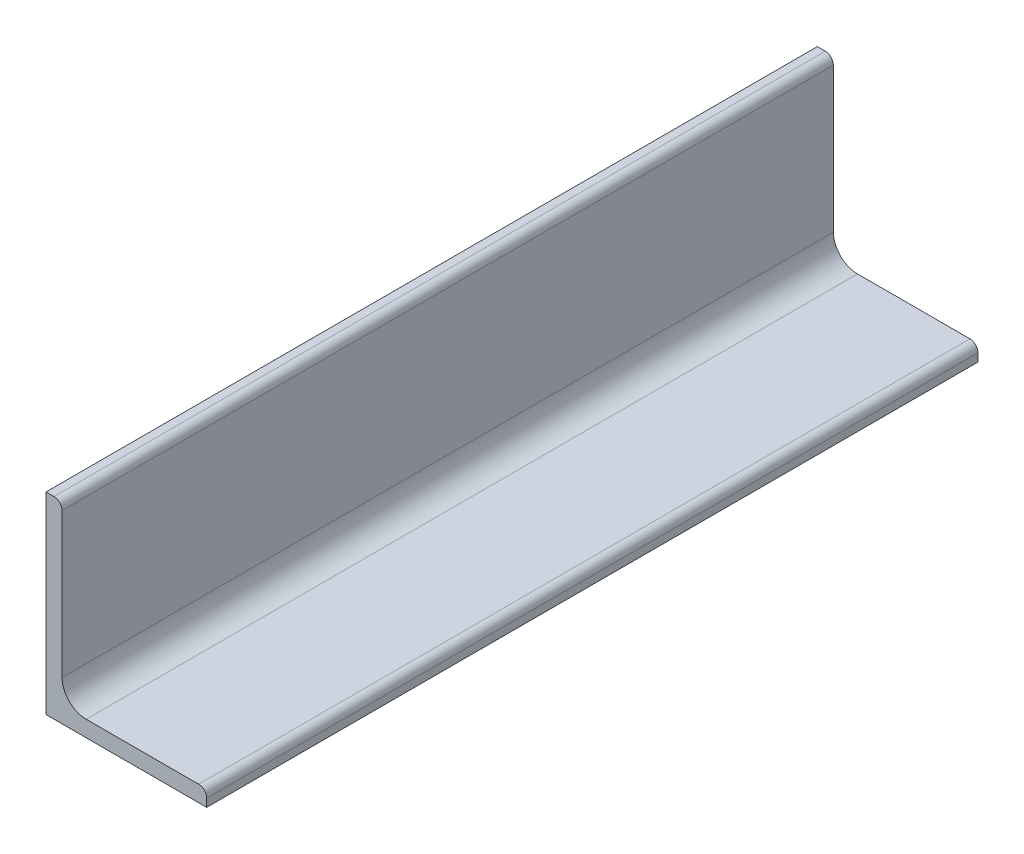
ISO-10303-21;
HEADER;
FILE_DESCRIPTION(('STEP AP214'),'2;1');
FILE_NAME('part.step','',(''),(''),'','','');
FILE_SCHEMA(('AUTOMOTIVE_DESIGN { 1 0 10303 214 1 1 1 1 }'));
ENDSEC;
DATA;
#1=APPLICATION_CONTEXT('core data for automotive mechanical design processes');
#2=APPLICATION_PROTOCOL_DEFINITION('international standard','automotive_design',2000,#1);
#3=PRODUCT_CONTEXT('',#1,'mechanical');
#4=PRODUCT('Part','Part','',(#3));
#5=PRODUCT_RELATED_PRODUCT_CATEGORY('part','',(#4));
#6=PRODUCT_DEFINITION_FORMATION('','',#4);
#7=PRODUCT_DEFINITION_CONTEXT('part definition',#1,'design');
#8=PRODUCT_DEFINITION('design','',#6,#7);
#9=PRODUCT_DEFINITION_SHAPE('','',#8);
#10=(LENGTH_UNIT() NAMED_UNIT(*) SI_UNIT(.MILLI.,.METRE.));
#11=(NAMED_UNIT(*) PLANE_ANGLE_UNIT() SI_UNIT($,.RADIAN.));
#12=(NAMED_UNIT(*) SI_UNIT($,.STERADIAN.) SOLID_ANGLE_UNIT());
#13=UNCERTAINTY_MEASURE_WITH_UNIT(LENGTH_MEASURE(1.E-05),#10,'distance_accuracy_value','');
#14=(GEOMETRIC_REPRESENTATION_CONTEXT(3) GLOBAL_UNCERTAINTY_ASSIGNED_CONTEXT((#13)) GLOBAL_UNIT_ASSIGNED_CONTEXT((#10,
#11,#12)) REPRESENTATION_CONTEXT('',''));
#15=CARTESIAN_POINT('',(0.,0.,0.));
#16=DIRECTION('',(0.,0.,1.));
#17=DIRECTION('',(1.,0.,0.));
#18=AXIS2_PLACEMENT_3D('',#15,#16,#17);
#19=CARTESIAN_POINT('',(0.897927251325018,76.2882459217981,304.8));
#20=DIRECTION('',(1.,0.,0.));
#21=DIRECTION('',(0.,0.,-1.));
#22=AXIS2_PLACEMENT_3D('',#19,#20,#21);
#23=PLANE('',#22);
#24=DIRECTION('',(0.,-1.,0.));
#25=VECTOR('',#24,1.);
#26=CARTESIAN_POINT('',(0.897927251325018,76.2882459217981,0.));
#27=LINE('',#26,#25);
#28=CARTESIAN_POINT('',(0.897927251325018,76.2882459217981,0.));
#29=VERTEX_POINT('',#28);
#30=CARTESIAN_POINT('',(0.897927251325018,0.0882459217980795,0.));
#31=VERTEX_POINT('',#30);
#32=EDGE_CURVE('E135',#29,#31,#27,.T.);
#33=ORIENTED_EDGE('',*,*,#32,.T.);
#34=DIRECTION('',(0.,0.,-1.));
#35=VECTOR('',#34,1.);
#36=CARTESIAN_POINT('',(0.897927251325018,0.0882459217980795,304.8));
#37=LINE('',#36,#35);
#38=CARTESIAN_POINT('',(0.897927251325018,0.0882459217980795,304.8));
#39=VERTEX_POINT('',#38);
#40=EDGE_CURVE('E11',#39,#31,#37,.T.);
#41=ORIENTED_EDGE('',*,*,#40,.F.);
#42=DIRECTION('',(0.,-1.,0.));
#43=VECTOR('',#42,1.);
#44=CARTESIAN_POINT('',(0.897927251325018,76.2882459217981,304.8));
#45=LINE('',#44,#43);
#46=CARTESIAN_POINT('',(0.897927251325018,76.2882459217981,304.8));
#47=VERTEX_POINT('',#46);
#48=EDGE_CURVE('E151',#47,#39,#45,.T.);
#49=ORIENTED_EDGE('',*,*,#48,.F.);
#50=DIRECTION('',(0.,0.,-1.));
#51=VECTOR('',#50,1.);
#52=CARTESIAN_POINT('',(0.897927251325018,76.2882459217981,304.8));
#53=LINE('',#52,#51);
#54=EDGE_CURVE('E131',#47,#29,#53,.T.);
#55=ORIENTED_EDGE('',*,*,#54,.T.);
#56=EDGE_LOOP('',(#33,#41,#49,#55));
#57=FACE_BOUND('',#56,.T.);
#58=ADVANCED_FACE('F33',(#57),#23,.F.);
#59=CARTESIAN_POINT('',(0.897927251325018,0.0882459217980795,304.8));
#60=DIRECTION('',(0.,1.,0.));
#61=DIRECTION('',(0.,0.,1.));
#62=AXIS2_PLACEMENT_3D('',#59,#60,#61);
#63=PLANE('',#62);
#64=DIRECTION('',(1.,0.,0.));
#65=VECTOR('',#64,1.);
#66=CARTESIAN_POINT('',(0.897927251325018,0.0882459217980795,0.));
#67=LINE('',#66,#65);
#68=CARTESIAN_POINT('',(64.397927251325,0.0882459217980795,0.));
#69=VERTEX_POINT('',#68);
#70=EDGE_CURVE('E138',#31,#69,#67,.T.);
#71=ORIENTED_EDGE('',*,*,#70,.T.);
#72=DIRECTION('',(0.,0.,-1.));
#73=VECTOR('',#72,1.);
#74=CARTESIAN_POINT('',(64.397927251325,0.0882459217980795,304.8));
#75=LINE('',#74,#73);
#76=CARTESIAN_POINT('',(64.397927251325,0.0882459217980795,304.8));
#77=VERTEX_POINT('',#76);
#78=EDGE_CURVE('E41',#77,#69,#75,.T.);
#79=ORIENTED_EDGE('',*,*,#78,.F.);
#80=DIRECTION('',(1.,0.,0.));
#81=VECTOR('',#80,1.);
#82=CARTESIAN_POINT('',(0.897927251325018,0.0882459217980795,304.8));
#83=LINE('',#82,#81);
#84=EDGE_CURVE('E95',#39,#77,#83,.T.);
#85=ORIENTED_EDGE('',*,*,#84,.F.);
#86=ORIENTED_EDGE('',*,*,#40,.T.);
#87=EDGE_LOOP('',(#71,#79,#85,#86));
#88=FACE_BOUND('',#87,.T.);
#89=ADVANCED_FACE('F194',(#88),#63,.F.);
#90=CARTESIAN_POINT('',(64.397927251325,0.0882459217980795,304.8));
#91=DIRECTION('',(-1.,0.,0.));
#92=DIRECTION('',(0.,0.,1.));
#93=AXIS2_PLACEMENT_3D('',#90,#91,#92);
#94=PLANE('',#93);
#95=DIRECTION('',(0.,1.,0.));
#96=VECTOR('',#95,1.);
#97=CARTESIAN_POINT('',(64.397927251325,0.0882459217980795,0.));
#98=LINE('',#97,#96);
#99=CARTESIAN_POINT('',(64.397927251325,3.26324592179808,0.));
#100=VERTEX_POINT('',#99);
#101=EDGE_CURVE('E140',#69,#100,#98,.T.);
#102=ORIENTED_EDGE('',*,*,#101,.T.);
#103=DIRECTION('',(0.,0.,-1.));
#104=VECTOR('',#103,1.);
#105=CARTESIAN_POINT('',(64.397927251325,3.26324592179808,304.8));
#106=LINE('',#105,#104);
#107=CARTESIAN_POINT('',(64.397927251325,3.26324592179808,304.8));
#108=VERTEX_POINT('',#107);
#109=EDGE_CURVE('E161',#108,#100,#106,.T.);
#110=ORIENTED_EDGE('',*,*,#109,.F.);
#111=DIRECTION('',(0.,1.,0.));
#112=VECTOR('',#111,1.);
#113=CARTESIAN_POINT('',(64.397927251325,0.0882459217980795,304.8));
#114=LINE('',#113,#112);
#115=EDGE_CURVE('E169',#77,#108,#114,.T.);
#116=ORIENTED_EDGE('',*,*,#115,.F.);
#117=ORIENTED_EDGE('',*,*,#78,.T.);
#118=EDGE_LOOP('',(#102,#110,#116,#117));
#119=FACE_BOUND('',#118,.T.);
#120=ADVANCED_FACE('F167',(#119),#94,.F.);
#121=CARTESIAN_POINT('',(61.222927251325,3.26324592179808,304.8));
#122=DIRECTION('',(0.,0.,-1.));
#123=DIRECTION('',(-1.,0.,0.));
#124=AXIS2_PLACEMENT_3D('',#121,#122,#123);
#125=CYLINDRICAL_SURFACE('',#124,3.175);
#126=CARTESIAN_POINT('',(61.222927251325,3.26324592179808,0.));
#127=DIRECTION('',(0.,0.,1.));
#128=DIRECTION('',(1.,0.,0.));
#129=AXIS2_PLACEMENT_3D('',#126,#127,#128);
#130=CIRCLE('',#129,3.175);
#131=CARTESIAN_POINT('',(61.222927251325,6.43824592179808,0.));
#132=VERTEX_POINT('',#131);
#133=EDGE_CURVE('E142',#100,#132,#130,.T.);
#134=ORIENTED_EDGE('',*,*,#133,.T.);
#135=DIRECTION('',(0.,0.,-1.));
#136=VECTOR('',#135,1.);
#137=CARTESIAN_POINT('',(61.222927251325,6.43824592179808,304.8));
#138=LINE('',#137,#136);
#139=CARTESIAN_POINT('',(61.222927251325,6.43824592179808,304.8));
#140=VERTEX_POINT('',#139);
#141=EDGE_CURVE('E158',#140,#132,#138,.T.);
#142=ORIENTED_EDGE('',*,*,#141,.F.);
#143=CARTESIAN_POINT('',(61.222927251325,3.26324592179808,304.8));
#144=DIRECTION('',(0.,0.,1.));
#145=DIRECTION('',(1.,0.,0.));
#146=AXIS2_PLACEMENT_3D('',#143,#144,#145);
#147=CIRCLE('',#146,3.175);
#148=EDGE_CURVE('E185',#108,#140,#147,.T.);
#149=ORIENTED_EDGE('',*,*,#148,.F.);
#150=ORIENTED_EDGE('',*,*,#109,.T.);
#151=EDGE_LOOP('',(#134,#142,#149,#150));
#152=FACE_BOUND('',#151,.T.);
#153=ADVANCED_FACE('F178',(#152),#125,.T.);
#154=CARTESIAN_POINT('',(61.222927251325,6.43824592179808,304.8));
#155=DIRECTION('',(0.,-1.,0.));
#156=DIRECTION('',(0.,0.,-1.));
#157=AXIS2_PLACEMENT_3D('',#154,#155,#156);
#158=PLANE('',#157);
#159=DIRECTION('',(-1.,0.,0.));
#160=VECTOR('',#159,1.);
#161=CARTESIAN_POINT('',(61.222927251325,6.43824592179808,0.));
#162=LINE('',#161,#160);
#163=CARTESIAN_POINT('',(16.772927251325,6.43824592179808,0.));
#164=VERTEX_POINT('',#163);
#165=EDGE_CURVE('E144',#132,#164,#162,.T.);
#166=ORIENTED_EDGE('',*,*,#165,.T.);
#167=DIRECTION('',(0.,0.,-1.));
#168=VECTOR('',#167,1.);
#169=CARTESIAN_POINT('',(16.772927251325,6.43824592179808,304.8));
#170=LINE('',#169,#168);
#171=CARTESIAN_POINT('',(16.772927251325,6.43824592179808,304.8));
#172=VERTEX_POINT('',#171);
#173=EDGE_CURVE('E155',#172,#164,#170,.T.);
#174=ORIENTED_EDGE('',*,*,#173,.F.);
#175=DIRECTION('',(-1.,0.,0.));
#176=VECTOR('',#175,1.);
#177=CARTESIAN_POINT('',(61.222927251325,6.43824592179808,304.8));
#178=LINE('',#177,#176);
#179=EDGE_CURVE('E184',#140,#172,#178,.T.);
#180=ORIENTED_EDGE('',*,*,#179,.F.);
#181=ORIENTED_EDGE('',*,*,#141,.T.);
#182=EDGE_LOOP('',(#166,#174,#180,#181));
#183=FACE_BOUND('',#182,.T.);
#184=ADVANCED_FACE('F182',(#183),#158,.F.);
#185=CARTESIAN_POINT('',(16.772927251325,15.9632459217981,304.8));
#186=DIRECTION('',(0.,0.,-1.));
#187=DIRECTION('',(-1.,0.,0.));
#188=AXIS2_PLACEMENT_3D('',#185,#186,#187);
#189=CYLINDRICAL_SURFACE('',#188,9.52499999999999);
#190=CARTESIAN_POINT('',(16.772927251325,15.9632459217981,0.));
#191=DIRECTION('',(0.,0.,-1.));
#192=DIRECTION('',(1.,0.,0.));
#193=AXIS2_PLACEMENT_3D('',#190,#191,#192);
#194=CIRCLE('',#193,9.52499999999999);
#195=CARTESIAN_POINT('',(7.24792725132502,15.9632459217981,0.));
#196=VERTEX_POINT('',#195);
#197=EDGE_CURVE('E146',#164,#196,#194,.T.);
#198=ORIENTED_EDGE('',*,*,#197,.T.);
#199=DIRECTION('',(0.,0.,-1.));
#200=VECTOR('',#199,1.);
#201=CARTESIAN_POINT('',(7.24792725132502,15.9632459217981,304.8));
#202=LINE('',#201,#200);
#203=CARTESIAN_POINT('',(7.24792725132502,15.9632459217981,304.8));
#204=VERTEX_POINT('',#203);
#205=EDGE_CURVE('E126',#204,#196,#202,.T.);
#206=ORIENTED_EDGE('',*,*,#205,.F.);
#207=CARTESIAN_POINT('',(16.772927251325,15.9632459217981,304.8));
#208=DIRECTION('',(0.,0.,-1.));
#209=DIRECTION('',(1.,0.,0.));
#210=AXIS2_PLACEMENT_3D('',#207,#208,#209);
#211=CIRCLE('',#210,9.52499999999999);
#212=EDGE_CURVE('E117',#172,#204,#211,.T.);
#213=ORIENTED_EDGE('',*,*,#212,.F.);
#214=ORIENTED_EDGE('',*,*,#173,.T.);
#215=EDGE_LOOP('',(#198,#206,#213,#214));
#216=FACE_BOUND('',#215,.T.);
#217=ADVANCED_FACE('F206',(#216),#189,.F.);
#218=CARTESIAN_POINT('',(7.24792725132502,15.9632459217981,304.8));
#219=DIRECTION('',(-1.,0.,0.));
#220=DIRECTION('',(0.,0.,1.));
#221=AXIS2_PLACEMENT_3D('',#218,#219,#220);
#222=PLANE('',#221);
#223=DIRECTION('',(0.,1.,0.));
#224=VECTOR('',#223,1.);
#225=CARTESIAN_POINT('',(7.24792725132502,15.9632459217981,0.));
#226=LINE('',#225,#224);
#227=CARTESIAN_POINT('',(7.24792725132502,73.1132459217981,0.));
#228=VERTEX_POINT('',#227);
#229=EDGE_CURVE('E125',#196,#228,#226,.T.);
#230=ORIENTED_EDGE('',*,*,#229,.T.);
#231=DIRECTION('',(0.,0.,-1.));
#232=VECTOR('',#231,1.);
#233=CARTESIAN_POINT('',(7.24792725132502,73.1132459217981,304.8));
#234=LINE('',#233,#232);
#235=CARTESIAN_POINT('',(7.24792725132502,73.1132459217981,304.8));
#236=VERTEX_POINT('',#235);
#237=EDGE_CURVE('E122',#236,#228,#234,.T.);
#238=ORIENTED_EDGE('',*,*,#237,.F.);
#239=DIRECTION('',(0.,1.,0.));
#240=VECTOR('',#239,1.);
#241=CARTESIAN_POINT('',(7.24792725132502,15.9632459217981,304.8));
#242=LINE('',#241,#240);
#243=EDGE_CURVE('E111',#204,#236,#242,.T.);
#244=ORIENTED_EDGE('',*,*,#243,.F.);
#245=ORIENTED_EDGE('',*,*,#205,.T.);
#246=EDGE_LOOP('',(#230,#238,#244,#245));
#247=FACE_BOUND('',#246,.T.);
#248=ADVANCED_FACE('F123',(#247),#222,.F.);
#249=CARTESIAN_POINT('',(4.07292725132502,73.1132459217981,304.8));
#250=DIRECTION('',(0.,0.,-1.));
#251=DIRECTION('',(-1.,0.,0.));
#252=AXIS2_PLACEMENT_3D('',#249,#250,#251);
#253=CYLINDRICAL_SURFACE('',#252,3.175);
#254=CARTESIAN_POINT('',(4.07292725132502,73.1132459217981,0.));
#255=DIRECTION('',(0.,0.,1.));
#256=DIRECTION('',(1.,0.,0.));
#257=AXIS2_PLACEMENT_3D('',#254,#255,#256);
#258=CIRCLE('',#257,3.175);
#259=CARTESIAN_POINT('',(4.07292725132502,76.2882459217981,0.));
#260=VERTEX_POINT('',#259);
#261=EDGE_CURVE('E81',#228,#260,#258,.T.);
#262=ORIENTED_EDGE('',*,*,#261,.T.);
#263=DIRECTION('',(0.,0.,-1.));
#264=VECTOR('',#263,1.);
#265=CARTESIAN_POINT('',(4.07292725132502,76.2882459217981,304.8));
#266=LINE('',#265,#264);
#267=CARTESIAN_POINT('',(4.07292725132502,76.2882459217981,304.8));
#268=VERTEX_POINT('',#267);
#269=EDGE_CURVE('E127',#268,#260,#266,.T.);
#270=ORIENTED_EDGE('',*,*,#269,.F.);
#271=CARTESIAN_POINT('',(4.07292725132502,73.1132459217981,304.8));
#272=DIRECTION('',(0.,0.,1.));
#273=DIRECTION('',(1.,0.,0.));
#274=AXIS2_PLACEMENT_3D('',#271,#272,#273);
#275=CIRCLE('',#274,3.175);
#276=EDGE_CURVE('E115',#236,#268,#275,.T.);
#277=ORIENTED_EDGE('',*,*,#276,.F.);
#278=ORIENTED_EDGE('',*,*,#237,.T.);
#279=EDGE_LOOP('',(#262,#270,#277,#278));
#280=FACE_BOUND('',#279,.T.);
#281=ADVANCED_FACE('F129',(#280),#253,.T.);
#282=CARTESIAN_POINT('',(4.07292725132502,76.2882459217981,304.8));
#283=DIRECTION('',(0.,-1.,0.));
#284=DIRECTION('',(0.,0.,-1.));
#285=AXIS2_PLACEMENT_3D('',#282,#283,#284);
#286=PLANE('',#285);
#287=DIRECTION('',(-1.,0.,0.));
#288=VECTOR('',#287,1.);
#289=CARTESIAN_POINT('',(4.07292725132502,76.2882459217981,0.));
#290=LINE('',#289,#288);
#291=EDGE_CURVE('E87',#260,#29,#290,.T.);
#292=ORIENTED_EDGE('',*,*,#291,.T.);
#293=ORIENTED_EDGE('',*,*,#54,.F.);
#294=DIRECTION('',(-1.,0.,0.));
#295=VECTOR('',#294,1.);
#296=CARTESIAN_POINT('',(4.07292725132502,76.2882459217981,304.8));
#297=LINE('',#296,#295);
#298=EDGE_CURVE('E49',#268,#47,#297,.T.);
#299=ORIENTED_EDGE('',*,*,#298,.F.);
#300=ORIENTED_EDGE('',*,*,#269,.T.);
#301=EDGE_LOOP('',(#292,#293,#299,#300));
#302=FACE_BOUND('',#301,.T.);
#303=ADVANCED_FACE('F214',(#302),#286,.F.);
#304=CARTESIAN_POINT('',(61.222927251325,3.26324592179808,304.8));
#305=DIRECTION('',(0.,0.,1.));
#306=DIRECTION('',(1.,0.,0.));
#307=AXIS2_PLACEMENT_3D('',#304,#305,#306);
#308=PLANE('',#307);
#309=ORIENTED_EDGE('',*,*,#48,.T.);
#310=ORIENTED_EDGE('',*,*,#84,.T.);
#311=ORIENTED_EDGE('',*,*,#115,.T.);
#312=ORIENTED_EDGE('',*,*,#148,.T.);
#313=ORIENTED_EDGE('',*,*,#179,.T.);
#314=ORIENTED_EDGE('',*,*,#212,.T.);
#315=ORIENTED_EDGE('',*,*,#243,.T.);
#316=ORIENTED_EDGE('',*,*,#276,.T.);
#317=ORIENTED_EDGE('',*,*,#298,.T.);
#318=EDGE_LOOP('',(#309,#310,#311,#312,#313,#314,#315,#316,#317));
#319=FACE_BOUND('',#318,.T.);
#320=ADVANCED_FACE('F113',(#319),#308,.T.);
#321=CARTESIAN_POINT('',(61.222927251325,3.26324592179808,0.));
#322=DIRECTION('',(0.,0.,1.));
#323=DIRECTION('',(1.,0.,0.));
#324=AXIS2_PLACEMENT_3D('',#321,#322,#323);
#325=PLANE('',#324);
#326=ORIENTED_EDGE('',*,*,#32,.F.);
#327=ORIENTED_EDGE('',*,*,#291,.F.);
#328=ORIENTED_EDGE('',*,*,#261,.F.);
#329=ORIENTED_EDGE('',*,*,#229,.F.);
#330=ORIENTED_EDGE('',*,*,#197,.F.);
#331=ORIENTED_EDGE('',*,*,#165,.F.);
#332=ORIENTED_EDGE('',*,*,#133,.F.);
#333=ORIENTED_EDGE('',*,*,#101,.F.);
#334=ORIENTED_EDGE('',*,*,#70,.F.);
#335=EDGE_LOOP('',(#326,#327,#328,#329,#330,#331,#332,#333,#334));
#336=FACE_BOUND('',#335,.T.);
#337=ADVANCED_FACE('F173',(#336),#325,.F.);
#338=CLOSED_SHELL('',(#58,#89,#120,#153,#184,#217,#248,#281,#303,#320,#337));
#339=MANIFOLD_SOLID_BREP('B2',#338);
#340=ADVANCED_BREP_SHAPE_REPRESENTATION('',(#18,#339),#14);
#341=SHAPE_DEFINITION_REPRESENTATION(#9,#340);
ENDSEC;
END-ISO-10303-21;
